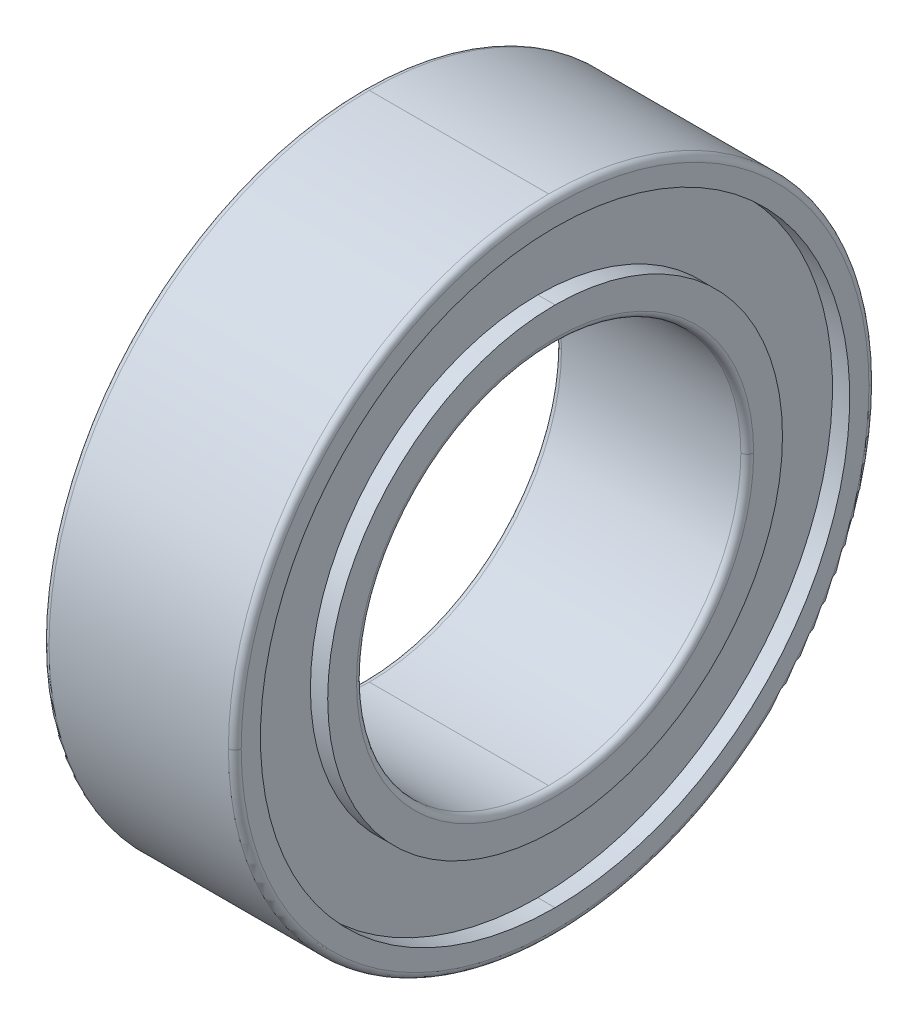
ISO-10303-21;
HEADER;
FILE_DESCRIPTION(('STEP AP214'),'2;1');
FILE_NAME('part.step','',(''),(''),'','','');
FILE_SCHEMA(('AUTOMOTIVE_DESIGN { 1 0 10303 214 1 1 1 1 }'));
ENDSEC;
DATA;
#1=APPLICATION_CONTEXT('core data for automotive mechanical design processes');
#2=APPLICATION_PROTOCOL_DEFINITION('international standard','automotive_design',2000,#1);
#3=PRODUCT_CONTEXT('',#1,'mechanical');
#4=PRODUCT('Part','Part','',(#3));
#5=PRODUCT_RELATED_PRODUCT_CATEGORY('part','',(#4));
#6=PRODUCT_DEFINITION_FORMATION('','',#4);
#7=PRODUCT_DEFINITION_CONTEXT('part definition',#1,'design');
#8=PRODUCT_DEFINITION('design','',#6,#7);
#9=PRODUCT_DEFINITION_SHAPE('','',#8);
#10=(LENGTH_UNIT() NAMED_UNIT(*) SI_UNIT(.MILLI.,.METRE.));
#11=(NAMED_UNIT(*) PLANE_ANGLE_UNIT() SI_UNIT($,.RADIAN.));
#12=(NAMED_UNIT(*) SI_UNIT($,.STERADIAN.) SOLID_ANGLE_UNIT());
#13=UNCERTAINTY_MEASURE_WITH_UNIT(LENGTH_MEASURE(1.E-05),#10,'distance_accuracy_value','');
#14=(GEOMETRIC_REPRESENTATION_CONTEXT(3) GLOBAL_UNCERTAINTY_ASSIGNED_CONTEXT((#13)) GLOBAL_UNIT_ASSIGNED_CONTEXT((#10,
#11,#12)) REPRESENTATION_CONTEXT('',''));
#15=CARTESIAN_POINT('',(0.,0.,0.));
#16=DIRECTION('',(0.,0.,1.));
#17=DIRECTION('',(1.,0.,0.));
#18=AXIS2_PLACEMENT_3D('',#15,#16,#17);
#19=CARTESIAN_POINT('',(0.,4.75,0.));
#20=DIRECTION('',(-1.,0.,0.));
#21=DIRECTION('',(0.,0.,1.));
#22=AXIS2_PLACEMENT_3D('',#19,#20,#21);
#23=PLANE('',#22);
#24=CARTESIAN_POINT('',(0.,0.,0.));
#25=DIRECTION('',(-1.,0.,0.));
#26=DIRECTION('',(0.,1.,0.));
#27=AXIS2_PLACEMENT_3D('',#24,#25,#26);
#28=CIRCLE('',#27,4.6);
#29=CARTESIAN_POINT('',(0.,4.6,0.));
#30=VERTEX_POINT('',#29);
#31=CARTESIAN_POINT('',(0.,-4.6,0.));
#32=VERTEX_POINT('',#31);
#33=EDGE_CURVE('E36',#30,#32,#28,.T.);
#34=ORIENTED_EDGE('',*,*,#33,.F.);
#35=CARTESIAN_POINT('',(0.,0.,0.));
#36=DIRECTION('',(-1.,0.,0.));
#37=DIRECTION('',(0.,1.,0.));
#38=AXIS2_PLACEMENT_3D('',#35,#36,#37);
#39=CIRCLE('',#38,4.6);
#40=EDGE_CURVE('E374',#32,#30,#39,.T.);
#41=ORIENTED_EDGE('',*,*,#40,.F.);
#42=EDGE_LOOP('',(#34,#41));
#43=FACE_BOUND('',#42,.T.);
#44=CARTESIAN_POINT('',(0.,0.,0.));
#45=DIRECTION('',(-1.,0.,0.));
#46=DIRECTION('',(0.,1.,0.));
#47=AXIS2_PLACEMENT_3D('',#44,#45,#46);
#48=CIRCLE('',#47,4.9);
#49=CARTESIAN_POINT('',(0.,4.9,0.));
#50=VERTEX_POINT('',#49);
#51=CARTESIAN_POINT('',(0.,0.,-4.9));
#52=VERTEX_POINT('',#51);
#53=EDGE_CURVE('E437',#50,#52,#48,.T.);
#54=ORIENTED_EDGE('',*,*,#53,.T.);
#55=CARTESIAN_POINT('',(0.,0.,0.));
#56=DIRECTION('',(-1.,0.,0.));
#57=DIRECTION('',(0.,1.,0.));
#58=AXIS2_PLACEMENT_3D('',#55,#56,#57);
#59=CIRCLE('',#58,4.9);
#60=CARTESIAN_POINT('',(0.,0.,4.9));
#61=VERTEX_POINT('',#60);
#62=EDGE_CURVE('E10',#52,#61,#59,.T.);
#63=ORIENTED_EDGE('',*,*,#62,.T.);
#64=CARTESIAN_POINT('',(0.,0.,0.));
#65=DIRECTION('',(-1.,0.,0.));
#66=DIRECTION('',(0.,1.,0.));
#67=AXIS2_PLACEMENT_3D('',#64,#65,#66);
#68=CIRCLE('',#67,4.9);
#69=EDGE_CURVE('E426',#61,#50,#68,.T.);
#70=ORIENTED_EDGE('',*,*,#69,.T.);
#71=EDGE_LOOP('',(#54,#63,#70));
#72=FACE_BOUND('',#71,.T.);
#73=ADVANCED_FACE('F16',(#43,#72),#23,.T.);
#74=CARTESIAN_POINT('',(0.1,0.,0.));
#75=DIRECTION('',(-1.,0.,0.));
#76=DIRECTION('',(0.,0.,1.));
#77=AXIS2_PLACEMENT_3D('',#74,#75,#76);
#78=TOROIDAL_SURFACE('',#77,4.9,0.1);
#79=CARTESIAN_POINT('',(0.1,0.,4.9));
#80=DIRECTION('',(0.,-1.,0.));
#81=DIRECTION('',(0.,0.,1.));
#82=AXIS2_PLACEMENT_3D('',#79,#80,#81);
#83=CIRCLE('',#82,0.1);
#84=CARTESIAN_POINT('',(0.1,0.,5.));
#85=VERTEX_POINT('',#84);
#86=EDGE_CURVE('E408',#85,#61,#83,.T.);
#87=ORIENTED_EDGE('',*,*,#86,.T.);
#88=ORIENTED_EDGE('',*,*,#62,.F.);
#89=CARTESIAN_POINT('',(0.1,0.,-4.9));
#90=DIRECTION('',(0.,-1.,0.));
#91=DIRECTION('',(0.,0.,-1.));
#92=AXIS2_PLACEMENT_3D('',#89,#90,#91);
#93=CIRCLE('',#92,0.1);
#94=CARTESIAN_POINT('',(0.1,0.,-5.));
#95=VERTEX_POINT('',#94);
#96=EDGE_CURVE('E444',#52,#95,#93,.T.);
#97=ORIENTED_EDGE('',*,*,#96,.T.);
#98=CARTESIAN_POINT('',(0.1,0.,0.));
#99=DIRECTION('',(-1.,0.,0.));
#100=DIRECTION('',(0.,1.,0.));
#101=AXIS2_PLACEMENT_3D('',#98,#99,#100);
#102=CIRCLE('',#101,5.);
#103=CARTESIAN_POINT('',(0.1,-5.,0.));
#104=VERTEX_POINT('',#103);
#105=EDGE_CURVE('E410',#95,#104,#102,.T.);
#106=ORIENTED_EDGE('',*,*,#105,.T.);
#107=CARTESIAN_POINT('',(0.1,0.,0.));
#108=DIRECTION('',(-1.,0.,0.));
#109=DIRECTION('',(0.,1.,0.));
#110=AXIS2_PLACEMENT_3D('',#107,#108,#109);
#111=CIRCLE('',#110,5.);
#112=EDGE_CURVE('E19',#104,#85,#111,.T.);
#113=ORIENTED_EDGE('',*,*,#112,.T.);
#114=EDGE_LOOP('',(#87,#88,#97,#106,#113));
#115=FACE_BOUND('',#114,.T.);
#116=ADVANCED_FACE('F406',(#115),#78,.T.);
#117=CARTESIAN_POINT('',(1.5,0.,0.));
#118=DIRECTION('',(1.,0.,0.));
#119=DIRECTION('',(0.,1.,0.));
#120=AXIS2_PLACEMENT_3D('',#117,#118,#119);
#121=CYLINDRICAL_SURFACE('',#120,5.);
#122=DIRECTION('',(-1.,0.,0.));
#123=VECTOR('',#122,1.);
#124=CARTESIAN_POINT('',(1.5,5.,0.));
#125=LINE('',#124,#123);
#126=CARTESIAN_POINT('',(2.9,5.,0.));
#127=VERTEX_POINT('',#126);
#128=CARTESIAN_POINT('',(0.1,5.,0.));
#129=VERTEX_POINT('',#128);
#130=EDGE_CURVE('E416',#127,#129,#125,.T.);
#131=ORIENTED_EDGE('',*,*,#130,.T.);
#132=CARTESIAN_POINT('',(0.1,0.,0.));
#133=DIRECTION('',(-1.,0.,0.));
#134=DIRECTION('',(0.,1.,0.));
#135=AXIS2_PLACEMENT_3D('',#132,#133,#134);
#136=CIRCLE('',#135,5.);
#137=EDGE_CURVE('E413',#85,#129,#136,.T.);
#138=ORIENTED_EDGE('',*,*,#137,.F.);
#139=ORIENTED_EDGE('',*,*,#112,.F.);
#140=DIRECTION('',(1.,0.,0.));
#141=VECTOR('',#140,1.);
#142=CARTESIAN_POINT('',(1.5,-5.,0.));
#143=LINE('',#142,#141);
#144=CARTESIAN_POINT('',(2.9,-5.,0.));
#145=VERTEX_POINT('',#144);
#146=EDGE_CURVE('E455',#104,#145,#143,.T.);
#147=ORIENTED_EDGE('',*,*,#146,.T.);
#148=CARTESIAN_POINT('',(2.9,0.,0.));
#149=DIRECTION('',(-1.,0.,0.));
#150=DIRECTION('',(0.,1.,0.));
#151=AXIS2_PLACEMENT_3D('',#148,#149,#150);
#152=CIRCLE('',#151,5.);
#153=CARTESIAN_POINT('',(2.9,0.,5.));
#154=VERTEX_POINT('',#153);
#155=EDGE_CURVE('E224',#145,#154,#152,.T.);
#156=ORIENTED_EDGE('',*,*,#155,.T.);
#157=CARTESIAN_POINT('',(2.9,0.,0.));
#158=DIRECTION('',(-1.,0.,0.));
#159=DIRECTION('',(0.,1.,0.));
#160=AXIS2_PLACEMENT_3D('',#157,#158,#159);
#161=CIRCLE('',#160,5.);
#162=EDGE_CURVE('E236',#154,#127,#161,.T.);
#163=ORIENTED_EDGE('',*,*,#162,.T.);
#164=EDGE_LOOP('',(#131,#138,#139,#147,#156,#163));
#165=FACE_BOUND('',#164,.T.);
#166=ADVANCED_FACE('F414',(#165),#121,.T.);
#167=CARTESIAN_POINT('',(2.9,0.,0.));
#168=DIRECTION('',(-1.,0.,0.));
#169=DIRECTION('',(0.,0.,1.));
#170=AXIS2_PLACEMENT_3D('',#167,#168,#169);
#171=TOROIDAL_SURFACE('',#170,4.9,0.1);
#172=CARTESIAN_POINT('',(2.9,0.,4.9));
#173=DIRECTION('',(0.,-1.,0.));
#174=DIRECTION('',(0.,0.,1.));
#175=AXIS2_PLACEMENT_3D('',#172,#173,#174);
#176=CIRCLE('',#175,0.1);
#177=CARTESIAN_POINT('',(3.,0.,4.9));
#178=VERTEX_POINT('',#177);
#179=EDGE_CURVE('E244',#178,#154,#176,.T.);
#180=ORIENTED_EDGE('',*,*,#179,.T.);
#181=ORIENTED_EDGE('',*,*,#155,.F.);
#182=CARTESIAN_POINT('',(2.9,0.,0.));
#183=DIRECTION('',(-1.,0.,0.));
#184=DIRECTION('',(0.,1.,0.));
#185=AXIS2_PLACEMENT_3D('',#182,#183,#184);
#186=CIRCLE('',#185,5.);
#187=CARTESIAN_POINT('',(2.9,0.,-5.));
#188=VERTEX_POINT('',#187);
#189=EDGE_CURVE('E231',#188,#145,#186,.T.);
#190=ORIENTED_EDGE('',*,*,#189,.F.);
#191=CARTESIAN_POINT('',(2.9,0.,-4.9));
#192=DIRECTION('',(0.,-1.,0.));
#193=DIRECTION('',(0.,0.,-1.));
#194=AXIS2_PLACEMENT_3D('',#191,#192,#193);
#195=CIRCLE('',#194,0.1);
#196=CARTESIAN_POINT('',(3.,0.,-4.9));
#197=VERTEX_POINT('',#196);
#198=EDGE_CURVE('E228',#188,#197,#195,.T.);
#199=ORIENTED_EDGE('',*,*,#198,.T.);
#200=CARTESIAN_POINT('',(3.,0.,0.));
#201=DIRECTION('',(-1.,0.,0.));
#202=DIRECTION('',(0.,1.,0.));
#203=AXIS2_PLACEMENT_3D('',#200,#201,#202);
#204=CIRCLE('',#203,4.9);
#205=EDGE_CURVE('E213',#197,#178,#204,.T.);
#206=ORIENTED_EDGE('',*,*,#205,.T.);
#207=EDGE_LOOP('',(#180,#181,#190,#199,#206));
#208=FACE_BOUND('',#207,.T.);
#209=ADVANCED_FACE('F229',(#208),#171,.T.);
#210=CARTESIAN_POINT('',(3.,4.75,0.));
#211=DIRECTION('',(1.,0.,0.));
#212=DIRECTION('',(0.,1.,0.));
#213=AXIS2_PLACEMENT_3D('',#210,#211,#212);
#214=PLANE('',#213);
#215=CARTESIAN_POINT('',(3.,0.,0.));
#216=DIRECTION('',(-1.,0.,0.));
#217=DIRECTION('',(0.,1.,0.));
#218=AXIS2_PLACEMENT_3D('',#215,#216,#217);
#219=CIRCLE('',#218,4.6);
#220=CARTESIAN_POINT('',(3.,4.6,0.));
#221=VERTEX_POINT('',#220);
#222=CARTESIAN_POINT('',(3.,-4.6,0.));
#223=VERTEX_POINT('',#222);
#224=EDGE_CURVE('E225',#221,#223,#219,.T.);
#225=ORIENTED_EDGE('',*,*,#224,.T.);
#226=CARTESIAN_POINT('',(3.,0.,0.));
#227=DIRECTION('',(-1.,0.,0.));
#228=DIRECTION('',(0.,1.,0.));
#229=AXIS2_PLACEMENT_3D('',#226,#227,#228);
#230=CIRCLE('',#229,4.6);
#231=EDGE_CURVE('E259',#223,#221,#230,.T.);
#232=ORIENTED_EDGE('',*,*,#231,.T.);
#233=EDGE_LOOP('',(#225,#232));
#234=FACE_BOUND('',#233,.T.);
#235=CARTESIAN_POINT('',(3.,0.,0.));
#236=DIRECTION('',(-1.,0.,0.));
#237=DIRECTION('',(0.,1.,0.));
#238=AXIS2_PLACEMENT_3D('',#235,#236,#237);
#239=CIRCLE('',#238,4.9);
#240=CARTESIAN_POINT('',(3.,4.9,0.));
#241=VERTEX_POINT('',#240);
#242=EDGE_CURVE('E217',#241,#197,#239,.T.);
#243=ORIENTED_EDGE('',*,*,#242,.F.);
#244=CARTESIAN_POINT('',(3.,0.,0.));
#245=DIRECTION('',(-1.,0.,0.));
#246=DIRECTION('',(0.,1.,0.));
#247=AXIS2_PLACEMENT_3D('',#244,#245,#246);
#248=CIRCLE('',#247,4.9);
#249=EDGE_CURVE('E219',#178,#241,#248,.T.);
#250=ORIENTED_EDGE('',*,*,#249,.F.);
#251=ORIENTED_EDGE('',*,*,#205,.F.);
#252=EDGE_LOOP('',(#243,#250,#251));
#253=FACE_BOUND('',#252,.T.);
#254=ADVANCED_FACE('F215',(#234,#253),#214,.T.);
#255=CARTESIAN_POINT('',(2.865,0.,0.));
#256=DIRECTION('',(1.,0.,0.));
#257=DIRECTION('',(0.,1.,0.));
#258=AXIS2_PLACEMENT_3D('',#255,#256,#257);
#259=CYLINDRICAL_SURFACE('',#258,4.6);
#260=DIRECTION('',(-1.,0.,0.));
#261=VECTOR('',#260,1.);
#262=CARTESIAN_POINT('',(2.865,4.6,0.));
#263=LINE('',#262,#261);
#264=CARTESIAN_POINT('',(2.73,4.6,0.));
#265=VERTEX_POINT('',#264);
#266=EDGE_CURVE('E252',#221,#265,#263,.T.);
#267=ORIENTED_EDGE('',*,*,#266,.T.);
#268=CARTESIAN_POINT('',(2.73,0.,0.));
#269=DIRECTION('',(-1.,0.,0.));
#270=DIRECTION('',(0.,1.,0.));
#271=AXIS2_PLACEMENT_3D('',#268,#269,#270);
#272=CIRCLE('',#271,4.6);
#273=CARTESIAN_POINT('',(2.73,-4.6,0.));
#274=VERTEX_POINT('',#273);
#275=EDGE_CURVE('E316',#265,#274,#272,.T.);
#276=ORIENTED_EDGE('',*,*,#275,.T.);
#277=DIRECTION('',(1.,0.,0.));
#278=VECTOR('',#277,1.);
#279=CARTESIAN_POINT('',(2.865,-4.6,0.));
#280=LINE('',#279,#278);
#281=EDGE_CURVE('E269',#274,#223,#280,.T.);
#282=ORIENTED_EDGE('',*,*,#281,.T.);
#283=ORIENTED_EDGE('',*,*,#224,.F.);
#284=EDGE_LOOP('',(#267,#276,#282,#283));
#285=FACE_BOUND('',#284,.T.);
#286=ADVANCED_FACE('F480',(#285),#259,.F.);
#287=CARTESIAN_POINT('',(2.73,4.075,0.));
#288=DIRECTION('',(1.,0.,0.));
#289=DIRECTION('',(0.,1.,0.));
#290=AXIS2_PLACEMENT_3D('',#287,#288,#289);
#291=PLANE('',#290);
#292=CARTESIAN_POINT('',(2.73,0.,0.));
#293=DIRECTION('',(-1.,0.,0.));
#294=DIRECTION('',(0.,1.,0.));
#295=AXIS2_PLACEMENT_3D('',#292,#293,#294);
#296=CIRCLE('',#295,3.55);
#297=CARTESIAN_POINT('',(2.73,3.55,0.));
#298=VERTEX_POINT('',#297);
#299=CARTESIAN_POINT('',(2.73,-3.55,0.));
#300=VERTEX_POINT('',#299);
#301=EDGE_CURVE('E285',#298,#300,#296,.T.);
#302=ORIENTED_EDGE('',*,*,#301,.T.);
#303=CARTESIAN_POINT('',(2.73,0.,0.));
#304=DIRECTION('',(-1.,0.,0.));
#305=DIRECTION('',(0.,1.,0.));
#306=AXIS2_PLACEMENT_3D('',#303,#304,#305);
#307=CIRCLE('',#306,3.55);
#308=EDGE_CURVE('E319',#300,#298,#307,.T.);
#309=ORIENTED_EDGE('',*,*,#308,.T.);
#310=EDGE_LOOP('',(#302,#309));
#311=FACE_BOUND('',#310,.T.);
#312=ORIENTED_EDGE('',*,*,#275,.F.);
#313=CARTESIAN_POINT('',(2.73,0.,0.));
#314=DIRECTION('',(-1.,0.,0.));
#315=DIRECTION('',(0.,1.,0.));
#316=AXIS2_PLACEMENT_3D('',#313,#314,#315);
#317=CIRCLE('',#316,4.6);
#318=EDGE_CURVE('E273',#274,#265,#317,.T.);
#319=ORIENTED_EDGE('',*,*,#318,.F.);
#320=EDGE_LOOP('',(#312,#319));
#321=FACE_BOUND('',#320,.T.);
#322=ADVANCED_FACE('F477',(#311,#321),#291,.T.);
#323=CARTESIAN_POINT('',(2.865,0.,0.));
#324=DIRECTION('',(1.,0.,0.));
#325=DIRECTION('',(0.,1.,0.));
#326=AXIS2_PLACEMENT_3D('',#323,#324,#325);
#327=CYLINDRICAL_SURFACE('',#326,3.55);
#328=DIRECTION('',(-1.,0.,0.));
#329=VECTOR('',#328,1.);
#330=CARTESIAN_POINT('',(2.865,3.55,0.));
#331=LINE('',#330,#329);
#332=CARTESIAN_POINT('',(3.,3.55,0.));
#333=VERTEX_POINT('',#332);
#334=EDGE_CURVE('E247',#333,#298,#331,.T.);
#335=ORIENTED_EDGE('',*,*,#334,.T.);
#336=ORIENTED_EDGE('',*,*,#308,.F.);
#337=DIRECTION('',(1.,0.,0.));
#338=VECTOR('',#337,1.);
#339=CARTESIAN_POINT('',(2.865,-3.55,0.));
#340=LINE('',#339,#338);
#341=CARTESIAN_POINT('',(3.,-3.55,0.));
#342=VERTEX_POINT('',#341);
#343=EDGE_CURVE('E281',#300,#342,#340,.T.);
#344=ORIENTED_EDGE('',*,*,#343,.T.);
#345=CARTESIAN_POINT('',(3.,0.,0.));
#346=DIRECTION('',(-1.,0.,0.));
#347=DIRECTION('',(0.,1.,0.));
#348=AXIS2_PLACEMENT_3D('',#345,#346,#347);
#349=CIRCLE('',#348,3.55);
#350=EDGE_CURVE('E337',#342,#333,#349,.T.);
#351=ORIENTED_EDGE('',*,*,#350,.T.);
#352=EDGE_LOOP('',(#335,#336,#344,#351));
#353=FACE_BOUND('',#352,.T.);
#354=ADVANCED_FACE('F470',(#353),#327,.T.);
#355=CARTESIAN_POINT('',(3.,3.325,0.));
#356=DIRECTION('',(1.,0.,0.));
#357=DIRECTION('',(0.,-1.,0.));
#358=AXIS2_PLACEMENT_3D('',#355,#356,#357);
#359=PLANE('',#358);
#360=CARTESIAN_POINT('',(3.,0.,0.));
#361=DIRECTION('',(-1.,0.,0.));
#362=DIRECTION('',(0.,1.,0.));
#363=AXIS2_PLACEMENT_3D('',#360,#361,#362);
#364=CIRCLE('',#363,3.1);
#365=CARTESIAN_POINT('',(3.,3.1,0.));
#366=VERTEX_POINT('',#365);
#367=CARTESIAN_POINT('',(3.,0.,-3.1));
#368=VERTEX_POINT('',#367);
#369=EDGE_CURVE('E304',#366,#368,#364,.T.);
#370=ORIENTED_EDGE('',*,*,#369,.T.);
#371=CARTESIAN_POINT('',(3.,0.,0.));
#372=DIRECTION('',(-1.,0.,0.));
#373=DIRECTION('',(0.,1.,0.));
#374=AXIS2_PLACEMENT_3D('',#371,#372,#373);
#375=CIRCLE('',#374,3.1);
#376=CARTESIAN_POINT('',(3.,0.,3.1));
#377=VERTEX_POINT('',#376);
#378=EDGE_CURVE('E359',#368,#377,#375,.T.);
#379=ORIENTED_EDGE('',*,*,#378,.T.);
#380=CARTESIAN_POINT('',(3.,0.,0.));
#381=DIRECTION('',(-1.,0.,0.));
#382=DIRECTION('',(0.,1.,0.));
#383=AXIS2_PLACEMENT_3D('',#380,#381,#382);
#384=CIRCLE('',#383,3.1);
#385=EDGE_CURVE('E308',#377,#366,#384,.T.);
#386=ORIENTED_EDGE('',*,*,#385,.T.);
#387=EDGE_LOOP('',(#370,#379,#386));
#388=FACE_BOUND('',#387,.T.);
#389=CARTESIAN_POINT('',(3.,0.,0.));
#390=DIRECTION('',(-1.,0.,0.));
#391=DIRECTION('',(0.,1.,0.));
#392=AXIS2_PLACEMENT_3D('',#389,#390,#391);
#393=CIRCLE('',#392,3.55);
#394=EDGE_CURVE('E277',#333,#342,#393,.T.);
#395=ORIENTED_EDGE('',*,*,#394,.F.);
#396=ORIENTED_EDGE('',*,*,#350,.F.);
#397=EDGE_LOOP('',(#395,#396));
#398=FACE_BOUND('',#397,.T.);
#399=ADVANCED_FACE('F572',(#388,#398),#359,.T.);
#400=CARTESIAN_POINT('',(2.9,0.,0.));
#401=DIRECTION('',(-1.,0.,0.));
#402=DIRECTION('',(0.,0.,1.));
#403=AXIS2_PLACEMENT_3D('',#400,#401,#402);
#404=TOROIDAL_SURFACE('',#403,3.1,0.1);
#405=CARTESIAN_POINT('',(2.9,0.,3.1));
#406=DIRECTION('',(0.,-1.,0.));
#407=DIRECTION('',(0.,0.,1.));
#408=AXIS2_PLACEMENT_3D('',#405,#406,#407);
#409=CIRCLE('',#408,0.1);
#410=CARTESIAN_POINT('',(2.9,0.,3.));
#411=VERTEX_POINT('',#410);
#412=EDGE_CURVE('E286',#411,#377,#409,.T.);
#413=ORIENTED_EDGE('',*,*,#412,.T.);
#414=ORIENTED_EDGE('',*,*,#378,.F.);
#415=CARTESIAN_POINT('',(2.9,0.,-3.1));
#416=DIRECTION('',(0.,-1.,0.));
#417=DIRECTION('',(0.,0.,-1.));
#418=AXIS2_PLACEMENT_3D('',#415,#416,#417);
#419=CIRCLE('',#418,0.1);
#420=CARTESIAN_POINT('',(2.9,0.,-3.));
#421=VERTEX_POINT('',#420);
#422=EDGE_CURVE('E300',#368,#421,#419,.T.);
#423=ORIENTED_EDGE('',*,*,#422,.T.);
#424=CARTESIAN_POINT('',(2.9,0.,0.));
#425=DIRECTION('',(-1.,0.,0.));
#426=DIRECTION('',(0.,1.,0.));
#427=AXIS2_PLACEMENT_3D('',#424,#425,#426);
#428=CIRCLE('',#427,3.);
#429=CARTESIAN_POINT('',(2.9,-3.,0.));
#430=VERTEX_POINT('',#429);
#431=EDGE_CURVE('E356',#421,#430,#428,.T.);
#432=ORIENTED_EDGE('',*,*,#431,.T.);
#433=CARTESIAN_POINT('',(2.9,0.,0.));
#434=DIRECTION('',(-1.,0.,0.));
#435=DIRECTION('',(0.,1.,0.));
#436=AXIS2_PLACEMENT_3D('',#433,#434,#435);
#437=CIRCLE('',#436,3.);
#438=EDGE_CURVE('E315',#430,#411,#437,.T.);
#439=ORIENTED_EDGE('',*,*,#438,.T.);
#440=EDGE_LOOP('',(#413,#414,#423,#432,#439));
#441=FACE_BOUND('',#440,.T.);
#442=ADVANCED_FACE('F529',(#441),#404,.T.);
#443=CARTESIAN_POINT('',(1.5,0.,0.));
#444=DIRECTION('',(1.,0.,0.));
#445=DIRECTION('',(0.,1.,0.));
#446=AXIS2_PLACEMENT_3D('',#443,#444,#445);
#447=CYLINDRICAL_SURFACE('',#446,3.);
#448=DIRECTION('',(-1.,0.,0.));
#449=VECTOR('',#448,1.);
#450=CARTESIAN_POINT('',(1.5,3.,0.));
#451=LINE('',#450,#449);
#452=CARTESIAN_POINT('',(2.9,3.,0.));
#453=VERTEX_POINT('',#452);
#454=CARTESIAN_POINT('',(0.1,3.,0.));
#455=VERTEX_POINT('',#454);
#456=EDGE_CURVE('E311',#453,#455,#451,.T.);
#457=ORIENTED_EDGE('',*,*,#456,.T.);
#458=CARTESIAN_POINT('',(0.1,0.,0.));
#459=DIRECTION('',(-1.,0.,0.));
#460=DIRECTION('',(0.,1.,0.));
#461=AXIS2_PLACEMENT_3D('',#458,#459,#460);
#462=CIRCLE('',#461,3.);
#463=CARTESIAN_POINT('',(0.1,0.,-3.));
#464=VERTEX_POINT('',#463);
#465=EDGE_CURVE('E330',#455,#464,#462,.T.);
#466=ORIENTED_EDGE('',*,*,#465,.T.);
#467=CARTESIAN_POINT('',(0.1,0.,0.));
#468=DIRECTION('',(-1.,0.,0.));
#469=DIRECTION('',(0.,1.,0.));
#470=AXIS2_PLACEMENT_3D('',#467,#468,#469);
#471=CIRCLE('',#470,3.);
#472=CARTESIAN_POINT('',(0.1,-3.,0.));
#473=VERTEX_POINT('',#472);
#474=EDGE_CURVE('E360',#464,#473,#471,.T.);
#475=ORIENTED_EDGE('',*,*,#474,.T.);
#476=DIRECTION('',(1.,0.,0.));
#477=VECTOR('',#476,1.);
#478=CARTESIAN_POINT('',(1.5,-3.,0.));
#479=LINE('',#478,#477);
#480=EDGE_CURVE('E322',#473,#430,#479,.T.);
#481=ORIENTED_EDGE('',*,*,#480,.T.);
#482=ORIENTED_EDGE('',*,*,#431,.F.);
#483=CARTESIAN_POINT('',(2.9,0.,0.));
#484=DIRECTION('',(-1.,0.,0.));
#485=DIRECTION('',(0.,1.,0.));
#486=AXIS2_PLACEMENT_3D('',#483,#484,#485);
#487=CIRCLE('',#486,3.);
#488=EDGE_CURVE('E294',#453,#421,#487,.T.);
#489=ORIENTED_EDGE('',*,*,#488,.F.);
#490=EDGE_LOOP('',(#457,#466,#475,#481,#482,#489));
#491=FACE_BOUND('',#490,.T.);
#492=ADVANCED_FACE('F526',(#491),#447,.F.);
#493=CARTESIAN_POINT('',(0.1,0.,0.));
#494=DIRECTION('',(-1.,0.,0.));
#495=DIRECTION('',(0.,0.,1.));
#496=AXIS2_PLACEMENT_3D('',#493,#494,#495);
#497=TOROIDAL_SURFACE('',#496,3.1,0.1);
#498=CARTESIAN_POINT('',(0.1,0.,3.1));
#499=DIRECTION('',(0.,-1.,0.));
#500=DIRECTION('',(0.,0.,1.));
#501=AXIS2_PLACEMENT_3D('',#498,#499,#500);
#502=CIRCLE('',#501,0.1);
#503=CARTESIAN_POINT('',(0.,0.,3.1));
#504=VERTEX_POINT('',#503);
#505=CARTESIAN_POINT('',(0.1,0.,3.));
#506=VERTEX_POINT('',#505);
#507=EDGE_CURVE('E341',#504,#506,#502,.T.);
#508=ORIENTED_EDGE('',*,*,#507,.T.);
#509=CARTESIAN_POINT('',(0.1,0.,0.));
#510=DIRECTION('',(-1.,0.,0.));
#511=DIRECTION('',(0.,1.,0.));
#512=AXIS2_PLACEMENT_3D('',#509,#510,#511);
#513=CIRCLE('',#512,3.);
#514=EDGE_CURVE('E326',#473,#506,#513,.T.);
#515=ORIENTED_EDGE('',*,*,#514,.F.);
#516=ORIENTED_EDGE('',*,*,#474,.F.);
#517=CARTESIAN_POINT('',(0.1,0.,-3.1));
#518=DIRECTION('',(0.,-1.,0.));
#519=DIRECTION('',(0.,0.,-1.));
#520=AXIS2_PLACEMENT_3D('',#517,#518,#519);
#521=CIRCLE('',#520,0.1);
#522=CARTESIAN_POINT('',(0.,0.,-3.1));
#523=VERTEX_POINT('',#522);
#524=EDGE_CURVE('E352',#464,#523,#521,.T.);
#525=ORIENTED_EDGE('',*,*,#524,.T.);
#526=CARTESIAN_POINT('',(0.,0.,0.));
#527=DIRECTION('',(-1.,0.,0.));
#528=DIRECTION('',(0.,1.,0.));
#529=AXIS2_PLACEMENT_3D('',#526,#527,#528);
#530=CIRCLE('',#529,3.1);
#531=EDGE_CURVE('E378',#523,#504,#530,.T.);
#532=ORIENTED_EDGE('',*,*,#531,.T.);
#533=EDGE_LOOP('',(#508,#515,#516,#525,#532));
#534=FACE_BOUND('',#533,.T.);
#535=ADVANCED_FACE('F528',(#534),#497,.T.);
#536=CARTESIAN_POINT('',(0.,3.325,0.));
#537=DIRECTION('',(-1.,0.,0.));
#538=DIRECTION('',(0.,0.,1.));
#539=AXIS2_PLACEMENT_3D('',#536,#537,#538);
#540=PLANE('',#539);
#541=CARTESIAN_POINT('',(0.,0.,0.));
#542=DIRECTION('',(-1.,0.,0.));
#543=DIRECTION('',(0.,1.,0.));
#544=AXIS2_PLACEMENT_3D('',#541,#542,#543);
#545=CIRCLE('',#544,3.1);
#546=CARTESIAN_POINT('',(0.,3.1,0.));
#547=VERTEX_POINT('',#546);
#548=EDGE_CURVE('E348',#547,#523,#545,.T.);
#549=ORIENTED_EDGE('',*,*,#548,.F.);
#550=CARTESIAN_POINT('',(0.,0.,0.));
#551=DIRECTION('',(-1.,0.,0.));
#552=DIRECTION('',(0.,1.,0.));
#553=AXIS2_PLACEMENT_3D('',#550,#551,#552);
#554=CIRCLE('',#553,3.1);
#555=EDGE_CURVE('E344',#504,#547,#554,.T.);
#556=ORIENTED_EDGE('',*,*,#555,.F.);
#557=ORIENTED_EDGE('',*,*,#531,.F.);
#558=EDGE_LOOP('',(#549,#556,#557));
#559=FACE_BOUND('',#558,.T.);
#560=CARTESIAN_POINT('',(0.,0.,0.));
#561=DIRECTION('',(-1.,0.,0.));
#562=DIRECTION('',(0.,1.,0.));
#563=AXIS2_PLACEMENT_3D('',#560,#561,#562);
#564=CIRCLE('',#563,3.55);
#565=CARTESIAN_POINT('',(0.,3.55,0.));
#566=VERTEX_POINT('',#565);
#567=CARTESIAN_POINT('',(0.,-3.55,0.));
#568=VERTEX_POINT('',#567);
#569=EDGE_CURVE('E260',#566,#568,#564,.T.);
#570=ORIENTED_EDGE('',*,*,#569,.T.);
#571=CARTESIAN_POINT('',(0.,0.,0.));
#572=DIRECTION('',(-1.,0.,0.));
#573=DIRECTION('',(0.,1.,0.));
#574=AXIS2_PLACEMENT_3D('',#571,#572,#573);
#575=CIRCLE('',#574,3.55);
#576=EDGE_CURVE('E381',#568,#566,#575,.T.);
#577=ORIENTED_EDGE('',*,*,#576,.T.);
#578=EDGE_LOOP('',(#570,#577));
#579=FACE_BOUND('',#578,.T.);
#580=ADVANCED_FACE('F543',(#559,#579),#540,.T.);
#581=CARTESIAN_POINT('',(0.135,0.,0.));
#582=DIRECTION('',(1.,0.,0.));
#583=DIRECTION('',(0.,1.,0.));
#584=AXIS2_PLACEMENT_3D('',#581,#582,#583);
#585=CYLINDRICAL_SURFACE('',#584,3.55);
#586=DIRECTION('',(-1.,0.,0.));
#587=VECTOR('',#586,1.);
#588=CARTESIAN_POINT('',(0.135,3.55,0.));
#589=LINE('',#588,#587);
#590=CARTESIAN_POINT('',(0.27,3.55,0.));
#591=VERTEX_POINT('',#590);
#592=EDGE_CURVE('E299',#591,#566,#589,.T.);
#593=ORIENTED_EDGE('',*,*,#592,.T.);
#594=ORIENTED_EDGE('',*,*,#576,.F.);
#595=DIRECTION('',(1.,0.,0.));
#596=VECTOR('',#595,1.);
#597=CARTESIAN_POINT('',(0.135,-3.55,0.));
#598=LINE('',#597,#596);
#599=CARTESIAN_POINT('',(0.27,-3.55,0.));
#600=VERTEX_POINT('',#599);
#601=EDGE_CURVE('E265',#568,#600,#598,.T.);
#602=ORIENTED_EDGE('',*,*,#601,.T.);
#603=CARTESIAN_POINT('',(0.27,0.,0.));
#604=DIRECTION('',(-1.,0.,0.));
#605=DIRECTION('',(0.,1.,0.));
#606=AXIS2_PLACEMENT_3D('',#603,#604,#605);
#607=CIRCLE('',#606,3.55);
#608=EDGE_CURVE('E255',#600,#591,#607,.T.);
#609=ORIENTED_EDGE('',*,*,#608,.T.);
#610=EDGE_LOOP('',(#593,#594,#602,#609));
#611=FACE_BOUND('',#610,.T.);
#612=ADVANCED_FACE('F540',(#611),#585,.T.);
#613=CARTESIAN_POINT('',(0.27,4.075,0.));
#614=DIRECTION('',(-1.,0.,0.));
#615=DIRECTION('',(0.,0.,1.));
#616=AXIS2_PLACEMENT_3D('',#613,#614,#615);
#617=PLANE('',#616);
#618=CARTESIAN_POINT('',(0.27,0.,0.));
#619=DIRECTION('',(-1.,0.,0.));
#620=DIRECTION('',(0.,1.,0.));
#621=AXIS2_PLACEMENT_3D('',#618,#619,#620);
#622=CIRCLE('',#621,3.55);
#623=EDGE_CURVE('E295',#591,#600,#622,.T.);
#624=ORIENTED_EDGE('',*,*,#623,.F.);
#625=ORIENTED_EDGE('',*,*,#608,.F.);
#626=EDGE_LOOP('',(#624,#625));
#627=FACE_BOUND('',#626,.T.);
#628=CARTESIAN_POINT('',(0.27,0.,0.));
#629=DIRECTION('',(-1.,0.,0.));
#630=DIRECTION('',(0.,1.,0.));
#631=AXIS2_PLACEMENT_3D('',#628,#629,#630);
#632=CIRCLE('',#631,4.6);
#633=CARTESIAN_POINT('',(0.27,4.6,0.));
#634=VERTEX_POINT('',#633);
#635=CARTESIAN_POINT('',(0.27,-4.6,0.));
#636=VERTEX_POINT('',#635);
#637=EDGE_CURVE('E45',#634,#636,#632,.T.);
#638=ORIENTED_EDGE('',*,*,#637,.T.);
#639=CARTESIAN_POINT('',(0.27,0.,0.));
#640=DIRECTION('',(-1.,0.,0.));
#641=DIRECTION('',(0.,1.,0.));
#642=AXIS2_PLACEMENT_3D('',#639,#640,#641);
#643=CIRCLE('',#642,4.6);
#644=EDGE_CURVE('E368',#636,#634,#643,.T.);
#645=ORIENTED_EDGE('',*,*,#644,.T.);
#646=EDGE_LOOP('',(#638,#645));
#647=FACE_BOUND('',#646,.T.);
#648=ADVANCED_FACE('F542',(#627,#647),#617,.T.);
#649=CARTESIAN_POINT('',(0.135,0.,0.));
#650=DIRECTION('',(1.,0.,0.));
#651=DIRECTION('',(0.,1.,0.));
#652=AXIS2_PLACEMENT_3D('',#649,#650,#651);
#653=CYLINDRICAL_SURFACE('',#652,4.6);
#654=DIRECTION('',(-1.,0.,0.));
#655=VECTOR('',#654,1.);
#656=CARTESIAN_POINT('',(0.135,4.6,0.));
#657=LINE('',#656,#655);
#658=EDGE_CURVE('E264',#634,#30,#657,.T.);
#659=ORIENTED_EDGE('',*,*,#658,.T.);
#660=ORIENTED_EDGE('',*,*,#33,.T.);
#661=DIRECTION('',(1.,0.,0.));
#662=VECTOR('',#661,1.);
#663=CARTESIAN_POINT('',(0.135,-4.6,0.));
#664=LINE('',#663,#662);
#665=EDGE_CURVE('E371',#32,#636,#664,.T.);
#666=ORIENTED_EDGE('',*,*,#665,.T.);
#667=ORIENTED_EDGE('',*,*,#637,.F.);
#668=EDGE_LOOP('',(#659,#660,#666,#667));
#669=FACE_BOUND('',#668,.T.);
#670=ADVANCED_FACE('F675',(#669),#653,.F.);
#671=CARTESIAN_POINT('',(0.135,0.,0.));
#672=DIRECTION('',(1.,0.,0.));
#673=DIRECTION('',(0.,1.,0.));
#674=AXIS2_PLACEMENT_3D('',#671,#672,#673);
#675=CYLINDRICAL_SURFACE('',#674,4.6);
#676=ORIENTED_EDGE('',*,*,#658,.F.);
#677=ORIENTED_EDGE('',*,*,#644,.F.);
#678=ORIENTED_EDGE('',*,*,#665,.F.);
#679=ORIENTED_EDGE('',*,*,#40,.T.);
#680=EDGE_LOOP('',(#676,#677,#678,#679));
#681=FACE_BOUND('',#680,.T.);
#682=ADVANCED_FACE('F551',(#681),#675,.F.);
#683=CARTESIAN_POINT('',(0.135,0.,0.));
#684=DIRECTION('',(1.,0.,0.));
#685=DIRECTION('',(0.,1.,0.));
#686=AXIS2_PLACEMENT_3D('',#683,#684,#685);
#687=CYLINDRICAL_SURFACE('',#686,3.55);
#688=ORIENTED_EDGE('',*,*,#592,.F.);
#689=ORIENTED_EDGE('',*,*,#623,.T.);
#690=ORIENTED_EDGE('',*,*,#601,.F.);
#691=ORIENTED_EDGE('',*,*,#569,.F.);
#692=EDGE_LOOP('',(#688,#689,#690,#691));
#693=FACE_BOUND('',#692,.T.);
#694=ADVANCED_FACE('F546',(#693),#687,.T.);
#695=CARTESIAN_POINT('',(0.1,0.,0.));
#696=DIRECTION('',(-1.,0.,0.));
#697=DIRECTION('',(0.,0.,1.));
#698=AXIS2_PLACEMENT_3D('',#695,#696,#697);
#699=TOROIDAL_SURFACE('',#698,3.1,0.1);
#700=ORIENTED_EDGE('',*,*,#507,.F.);
#701=ORIENTED_EDGE('',*,*,#555,.T.);
#702=ORIENTED_EDGE('',*,*,#548,.T.);
#703=ORIENTED_EDGE('',*,*,#524,.F.);
#704=ORIENTED_EDGE('',*,*,#465,.F.);
#705=CARTESIAN_POINT('',(0.1,0.,0.));
#706=DIRECTION('',(-1.,0.,0.));
#707=DIRECTION('',(0.,1.,0.));
#708=AXIS2_PLACEMENT_3D('',#705,#706,#707);
#709=CIRCLE('',#708,3.);
#710=EDGE_CURVE('E334',#506,#455,#709,.T.);
#711=ORIENTED_EDGE('',*,*,#710,.F.);
#712=EDGE_LOOP('',(#700,#701,#702,#703,#704,#711));
#713=FACE_BOUND('',#712,.T.);
#714=ADVANCED_FACE('F538',(#713),#699,.T.);
#715=CARTESIAN_POINT('',(1.5,0.,0.));
#716=DIRECTION('',(1.,0.,0.));
#717=DIRECTION('',(0.,1.,0.));
#718=AXIS2_PLACEMENT_3D('',#715,#716,#717);
#719=CYLINDRICAL_SURFACE('',#718,3.);
#720=ORIENTED_EDGE('',*,*,#456,.F.);
#721=CARTESIAN_POINT('',(2.9,0.,0.));
#722=DIRECTION('',(-1.,0.,0.));
#723=DIRECTION('',(0.,1.,0.));
#724=AXIS2_PLACEMENT_3D('',#721,#722,#723);
#725=CIRCLE('',#724,3.);
#726=EDGE_CURVE('E290',#411,#453,#725,.T.);
#727=ORIENTED_EDGE('',*,*,#726,.F.);
#728=ORIENTED_EDGE('',*,*,#438,.F.);
#729=ORIENTED_EDGE('',*,*,#480,.F.);
#730=ORIENTED_EDGE('',*,*,#514,.T.);
#731=ORIENTED_EDGE('',*,*,#710,.T.);
#732=EDGE_LOOP('',(#720,#727,#728,#729,#730,#731));
#733=FACE_BOUND('',#732,.T.);
#734=ADVANCED_FACE('F534',(#733),#719,.F.);
#735=CARTESIAN_POINT('',(2.9,0.,0.));
#736=DIRECTION('',(-1.,0.,0.));
#737=DIRECTION('',(0.,0.,1.));
#738=AXIS2_PLACEMENT_3D('',#735,#736,#737);
#739=TOROIDAL_SURFACE('',#738,3.1,0.1);
#740=ORIENTED_EDGE('',*,*,#412,.F.);
#741=ORIENTED_EDGE('',*,*,#726,.T.);
#742=ORIENTED_EDGE('',*,*,#488,.T.);
#743=ORIENTED_EDGE('',*,*,#422,.F.);
#744=ORIENTED_EDGE('',*,*,#369,.F.);
#745=ORIENTED_EDGE('',*,*,#385,.F.);
#746=EDGE_LOOP('',(#740,#741,#742,#743,#744,#745));
#747=FACE_BOUND('',#746,.T.);
#748=ADVANCED_FACE('F523',(#747),#739,.T.);
#749=CARTESIAN_POINT('',(2.865,0.,0.));
#750=DIRECTION('',(1.,0.,0.));
#751=DIRECTION('',(0.,1.,0.));
#752=AXIS2_PLACEMENT_3D('',#749,#750,#751);
#753=CYLINDRICAL_SURFACE('',#752,3.55);
#754=ORIENTED_EDGE('',*,*,#334,.F.);
#755=ORIENTED_EDGE('',*,*,#394,.T.);
#756=ORIENTED_EDGE('',*,*,#343,.F.);
#757=ORIENTED_EDGE('',*,*,#301,.F.);
#758=EDGE_LOOP('',(#754,#755,#756,#757));
#759=FACE_BOUND('',#758,.T.);
#760=ADVANCED_FACE('F474',(#759),#753,.T.);
#761=CARTESIAN_POINT('',(2.865,0.,0.));
#762=DIRECTION('',(1.,0.,0.));
#763=DIRECTION('',(0.,1.,0.));
#764=AXIS2_PLACEMENT_3D('',#761,#762,#763);
#765=CYLINDRICAL_SURFACE('',#764,4.6);
#766=ORIENTED_EDGE('',*,*,#266,.F.);
#767=ORIENTED_EDGE('',*,*,#231,.F.);
#768=ORIENTED_EDGE('',*,*,#281,.F.);
#769=ORIENTED_EDGE('',*,*,#318,.T.);
#770=EDGE_LOOP('',(#766,#767,#768,#769));
#771=FACE_BOUND('',#770,.T.);
#772=ADVANCED_FACE('F487',(#771),#765,.F.);
#773=CARTESIAN_POINT('',(2.9,0.,0.));
#774=DIRECTION('',(-1.,0.,0.));
#775=DIRECTION('',(0.,0.,1.));
#776=AXIS2_PLACEMENT_3D('',#773,#774,#775);
#777=TOROIDAL_SURFACE('',#776,4.9,0.1);
#778=ORIENTED_EDGE('',*,*,#179,.F.);
#779=ORIENTED_EDGE('',*,*,#249,.T.);
#780=ORIENTED_EDGE('',*,*,#242,.T.);
#781=ORIENTED_EDGE('',*,*,#198,.F.);
#782=CARTESIAN_POINT('',(2.9,0.,0.));
#783=DIRECTION('',(-1.,0.,0.));
#784=DIRECTION('',(0.,1.,0.));
#785=AXIS2_PLACEMENT_3D('',#782,#783,#784);
#786=CIRCLE('',#785,5.);
#787=EDGE_CURVE('E452',#127,#188,#786,.T.);
#788=ORIENTED_EDGE('',*,*,#787,.F.);
#789=ORIENTED_EDGE('',*,*,#162,.F.);
#790=EDGE_LOOP('',(#778,#779,#780,#781,#788,#789));
#791=FACE_BOUND('',#790,.T.);
#792=ADVANCED_FACE('F238',(#791),#777,.T.);
#793=CARTESIAN_POINT('',(1.5,0.,0.));
#794=DIRECTION('',(1.,0.,0.));
#795=DIRECTION('',(0.,1.,0.));
#796=AXIS2_PLACEMENT_3D('',#793,#794,#795);
#797=CYLINDRICAL_SURFACE('',#796,5.);
#798=ORIENTED_EDGE('',*,*,#130,.F.);
#799=ORIENTED_EDGE('',*,*,#787,.T.);
#800=ORIENTED_EDGE('',*,*,#189,.T.);
#801=ORIENTED_EDGE('',*,*,#146,.F.);
#802=ORIENTED_EDGE('',*,*,#105,.F.);
#803=CARTESIAN_POINT('',(0.1,0.,0.));
#804=DIRECTION('',(-1.,0.,0.));
#805=DIRECTION('',(0.,1.,0.));
#806=AXIS2_PLACEMENT_3D('',#803,#804,#805);
#807=CIRCLE('',#806,5.);
#808=EDGE_CURVE('E421',#129,#95,#807,.T.);
#809=ORIENTED_EDGE('',*,*,#808,.F.);
#810=EDGE_LOOP('',(#798,#799,#800,#801,#802,#809));
#811=FACE_BOUND('',#810,.T.);
#812=ADVANCED_FACE('F510',(#811),#797,.T.);
#813=CARTESIAN_POINT('',(0.1,0.,0.));
#814=DIRECTION('',(-1.,0.,0.));
#815=DIRECTION('',(0.,0.,1.));
#816=AXIS2_PLACEMENT_3D('',#813,#814,#815);
#817=TOROIDAL_SURFACE('',#816,4.9,0.1);
#818=ORIENTED_EDGE('',*,*,#86,.F.);
#819=ORIENTED_EDGE('',*,*,#137,.T.);
#820=ORIENTED_EDGE('',*,*,#808,.T.);
#821=ORIENTED_EDGE('',*,*,#96,.F.);
#822=ORIENTED_EDGE('',*,*,#53,.F.);
#823=ORIENTED_EDGE('',*,*,#69,.F.);
#824=EDGE_LOOP('',(#818,#819,#820,#821,#822,#823));
#825=FACE_BOUND('',#824,.T.);
#826=ADVANCED_FACE('F424',(#825),#817,.T.);
#827=CLOSED_SHELL('',(#73,#116,#166,#209,#254,#286,#322,#354,#399,#442,#492,#535,#580,#612,#648,
#670,#682,#694,#714,#734,#748,#760,#772,#792,#812,#826));
#828=MANIFOLD_SOLID_BREP('B1',#827);
#829=ADVANCED_BREP_SHAPE_REPRESENTATION('',(#18,#828),#14);
#830=SHAPE_DEFINITION_REPRESENTATION(#9,#829);
ENDSEC;
END-ISO-10303-21;
